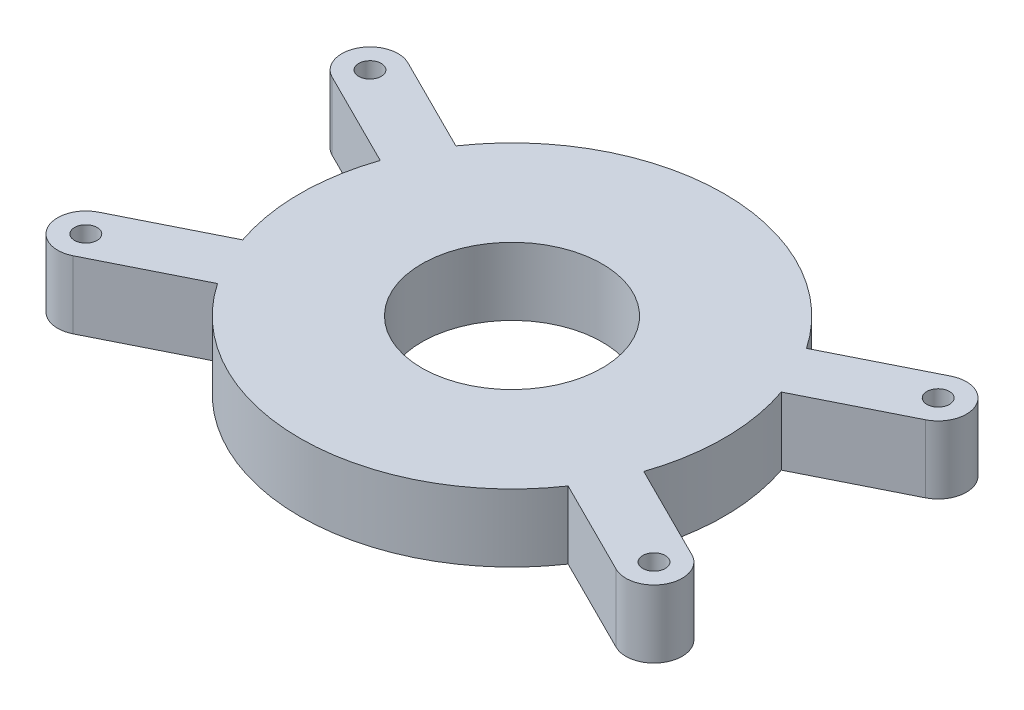
ISO-10303-21;
HEADER;
FILE_DESCRIPTION(('STEP AP214'),'2;1');
FILE_NAME('part.step','',(''),(''),'','','');
FILE_SCHEMA(('AUTOMOTIVE_DESIGN { 1 0 10303 214 1 1 1 1 }'));
ENDSEC;
DATA;
#1=APPLICATION_CONTEXT('core data for automotive mechanical design processes');
#2=APPLICATION_PROTOCOL_DEFINITION('international standard','automotive_design',2000,#1);
#3=PRODUCT_CONTEXT('',#1,'mechanical');
#4=PRODUCT('Part','Part','',(#3));
#5=PRODUCT_RELATED_PRODUCT_CATEGORY('part','',(#4));
#6=PRODUCT_DEFINITION_FORMATION('','',#4);
#7=PRODUCT_DEFINITION_CONTEXT('part definition',#1,'design');
#8=PRODUCT_DEFINITION('design','',#6,#7);
#9=PRODUCT_DEFINITION_SHAPE('','',#8);
#10=(LENGTH_UNIT() NAMED_UNIT(*) SI_UNIT(.MILLI.,.METRE.));
#11=(NAMED_UNIT(*) PLANE_ANGLE_UNIT() SI_UNIT($,.RADIAN.));
#12=(NAMED_UNIT(*) SI_UNIT($,.STERADIAN.) SOLID_ANGLE_UNIT());
#13=UNCERTAINTY_MEASURE_WITH_UNIT(LENGTH_MEASURE(1.E-05),#10,'distance_accuracy_value','');
#14=(GEOMETRIC_REPRESENTATION_CONTEXT(3) GLOBAL_UNCERTAINTY_ASSIGNED_CONTEXT((#13)) GLOBAL_UNIT_ASSIGNED_CONTEXT((#10,
#11,#12)) REPRESENTATION_CONTEXT('',''));
#15=CARTESIAN_POINT('',(0.,0.,0.));
#16=DIRECTION('',(0.,0.,1.));
#17=DIRECTION('',(1.,0.,0.));
#18=AXIS2_PLACEMENT_3D('',#15,#16,#17);
#19=CARTESIAN_POINT('',(0.,15.,0.));
#20=DIRECTION('',(0.,-1.,0.));
#21=DIRECTION('',(0.,0.,-1.));
#22=AXIS2_PLACEMENT_3D('',#19,#20,#21);
#23=CYLINDRICAL_SURFACE('',#22,47.);
#24=CARTESIAN_POINT('',(0.,0.,0.));
#25=DIRECTION('',(0.,1.,0.));
#26=DIRECTION('',(0.,0.,1.));
#27=AXIS2_PLACEMENT_3D('',#24,#25,#26);
#28=CIRCLE('',#27,47.);
#29=CARTESIAN_POINT('',(-38.8673659711493,0.,26.425893787434));
#30=VERTEX_POINT('',#29);
#31=CARTESIAN_POINT('',(38.8673659711494,0.,26.425893787434));
#32=VERTEX_POINT('',#31);
#33=EDGE_CURVE('E245',#30,#32,#28,.T.);
#34=ORIENTED_EDGE('',*,*,#33,.T.);
#35=DIRECTION('',(0.,-1.,0.));
#36=VECTOR('',#35,1.);
#37=CARTESIAN_POINT('',(38.8673659711494,15.,26.425893787434));
#38=LINE('',#37,#36);
#39=CARTESIAN_POINT('',(38.8673659711494,15.,26.425893787434));
#40=VERTEX_POINT('',#39);
#41=EDGE_CURVE('E12',#40,#32,#38,.T.);
#42=ORIENTED_EDGE('',*,*,#41,.F.);
#43=CARTESIAN_POINT('',(0.,15.,0.));
#44=DIRECTION('',(0.,1.,0.));
#45=DIRECTION('',(0.,0.,1.));
#46=AXIS2_PLACEMENT_3D('',#43,#44,#45);
#47=CIRCLE('',#46,47.);
#48=CARTESIAN_POINT('',(-38.8673659711493,15.,26.425893787434));
#49=VERTEX_POINT('',#48);
#50=EDGE_CURVE('E175',#49,#40,#47,.T.);
#51=ORIENTED_EDGE('',*,*,#50,.F.);
#52=DIRECTION('',(0.,-1.,0.));
#53=VECTOR('',#52,1.);
#54=CARTESIAN_POINT('',(-38.8673659711493,15.,26.425893787434));
#55=LINE('',#54,#53);
#56=EDGE_CURVE('E241',#49,#30,#55,.T.);
#57=ORIENTED_EDGE('',*,*,#56,.T.);
#58=EDGE_LOOP('',(#34,#42,#51,#57));
#59=FACE_BOUND('',#58,.T.);
#60=ADVANCED_FACE('F93',(#59),#23,.T.);
#61=CARTESIAN_POINT('',(-2.79556780261696,15.,5.58992850231311));
#62=DIRECTION('',(-0.447290848418707,0.,0.894388560370085));
#63=DIRECTION('',(0.894388560370085,0.,0.447290848418707));
#64=AXIS2_PLACEMENT_3D('',#61,#62,#63);
#65=PLANE('',#64);
#66=DIRECTION('',(-0.894388560370085,0.,-0.447290848418707));
#67=VECTOR('',#66,1.);
#68=CARTESIAN_POINT('',(-2.79556780261696,0.,5.58992850231311));
#69=LINE('',#68,#67);
#70=CARTESIAN_POINT('',(60.1908307594318,0.,37.089928502313));
#71=VERTEX_POINT('',#70);
#72=EDGE_CURVE('E249',#71,#32,#69,.T.);
#73=ORIENTED_EDGE('',*,*,#72,.F.);
#74=DIRECTION('',(0.,-1.,0.));
#75=VECTOR('',#74,1.);
#76=CARTESIAN_POINT('',(60.1908307594318,15.,37.089928502313));
#77=LINE('',#76,#75);
#78=CARTESIAN_POINT('',(60.1908307594318,15.,37.089928502313));
#79=VERTEX_POINT('',#78);
#80=EDGE_CURVE('E103',#79,#71,#77,.T.);
#81=ORIENTED_EDGE('',*,*,#80,.F.);
#82=DIRECTION('',(-0.894388560370085,0.,-0.447290848418707));
#83=VECTOR('',#82,1.);
#84=CARTESIAN_POINT('',(-2.79556780261696,15.,5.58992850231311));
#85=LINE('',#84,#83);
#86=EDGE_CURVE('E327',#79,#40,#85,.T.);
#87=ORIENTED_EDGE('',*,*,#86,.T.);
#88=ORIENTED_EDGE('',*,*,#41,.T.);
#89=EDGE_LOOP('',(#73,#81,#87,#88));
#90=FACE_BOUND('',#89,.T.);
#91=ADVANCED_FACE('F408',(#90),#65,.T.);
#92=CARTESIAN_POINT('',(62.9863985620487,15.,31.5));
#93=DIRECTION('',(0.,-1.,0.));
#94=DIRECTION('',(0.,0.,-1.));
#95=AXIS2_PLACEMENT_3D('',#92,#93,#94);
#96=CYLINDRICAL_SURFACE('',#95,6.25);
#97=CARTESIAN_POINT('',(62.9863985620487,0.,31.5));
#98=DIRECTION('',(0.,1.,0.));
#99=DIRECTION('',(0.,0.,1.));
#100=AXIS2_PLACEMENT_3D('',#97,#98,#99);
#101=CIRCLE('',#100,6.25);
#102=CARTESIAN_POINT('',(65.7819663646656,0.,25.9100714976869));
#103=VERTEX_POINT('',#102);
#104=EDGE_CURVE('E254',#103,#71,#101,.F.);
#105=ORIENTED_EDGE('',*,*,#104,.F.);
#106=DIRECTION('',(0.,-1.,0.));
#107=VECTOR('',#106,1.);
#108=CARTESIAN_POINT('',(65.7819663646656,15.,25.9100714976869));
#109=LINE('',#108,#107);
#110=CARTESIAN_POINT('',(65.7819663646656,15.,25.9100714976869));
#111=VERTEX_POINT('',#110);
#112=EDGE_CURVE('E301',#111,#103,#109,.T.);
#113=ORIENTED_EDGE('',*,*,#112,.F.);
#114=CARTESIAN_POINT('',(62.9863985620487,15.,31.5));
#115=DIRECTION('',(0.,1.,0.));
#116=DIRECTION('',(0.,0.,1.));
#117=AXIS2_PLACEMENT_3D('',#114,#115,#116);
#118=CIRCLE('',#117,6.25);
#119=EDGE_CURVE('E331',#111,#79,#118,.F.);
#120=ORIENTED_EDGE('',*,*,#119,.T.);
#121=ORIENTED_EDGE('',*,*,#80,.T.);
#122=EDGE_LOOP('',(#105,#113,#120,#121));
#123=FACE_BOUND('',#122,.T.);
#124=ADVANCED_FACE('F413',(#123),#96,.T.);
#125=CARTESIAN_POINT('',(2.7955678026169,15.,-5.58992850231299));
#126=DIRECTION('',(-0.447290848418707,0.,0.894388560370085));
#127=DIRECTION('',(0.894388560370085,0.,0.447290848418707));
#128=AXIS2_PLACEMENT_3D('',#125,#126,#127);
#129=PLANE('',#128);
#130=DIRECTION('',(-0.894388560370085,0.,-0.447290848418707));
#131=VECTOR('',#130,1.);
#132=CARTESIAN_POINT('',(2.7955678026169,0.,-5.58992850231299));
#133=LINE('',#132,#131);
#134=CARTESIAN_POINT('',(44.4585015763832,0.,15.2460367828079));
#135=VERTEX_POINT('',#134);
#136=EDGE_CURVE('E257',#103,#135,#133,.T.);
#137=ORIENTED_EDGE('',*,*,#136,.T.);
#138=DIRECTION('',(0.,-1.,0.));
#139=VECTOR('',#138,1.);
#140=CARTESIAN_POINT('',(44.4585015763832,15.,15.2460367828079));
#141=LINE('',#140,#139);
#142=CARTESIAN_POINT('',(44.4585015763832,15.,15.2460367828079));
#143=VERTEX_POINT('',#142);
#144=EDGE_CURVE('E298',#143,#135,#141,.T.);
#145=ORIENTED_EDGE('',*,*,#144,.F.);
#146=DIRECTION('',(-0.894388560370085,0.,-0.447290848418707));
#147=VECTOR('',#146,1.);
#148=CARTESIAN_POINT('',(2.7955678026169,15.,-5.58992850231299));
#149=LINE('',#148,#147);
#150=EDGE_CURVE('E334',#111,#143,#149,.T.);
#151=ORIENTED_EDGE('',*,*,#150,.F.);
#152=ORIENTED_EDGE('',*,*,#112,.T.);
#153=EDGE_LOOP('',(#137,#145,#151,#152));
#154=FACE_BOUND('',#153,.T.);
#155=ADVANCED_FACE('F419',(#154),#129,.F.);
#156=CARTESIAN_POINT('',(44.4585015763832,0.,-15.2460367828079));
#157=VERTEX_POINT('',#156);
#158=EDGE_CURVE('E251',#135,#157,#28,.T.);
#159=ORIENTED_EDGE('',*,*,#158,.T.);
#160=DIRECTION('',(0.,-1.,0.));
#161=VECTOR('',#160,1.);
#162=CARTESIAN_POINT('',(44.4585015763832,15.,-15.2460367828079));
#163=LINE('',#162,#161);
#164=CARTESIAN_POINT('',(44.4585015763832,15.,-15.2460367828079));
#165=VERTEX_POINT('',#164);
#166=EDGE_CURVE('E296',#165,#157,#163,.T.);
#167=ORIENTED_EDGE('',*,*,#166,.F.);
#168=EDGE_CURVE('E328',#143,#165,#47,.T.);
#169=ORIENTED_EDGE('',*,*,#168,.F.);
#170=ORIENTED_EDGE('',*,*,#144,.T.);
#171=EDGE_LOOP('',(#159,#167,#169,#170));
#172=FACE_BOUND('',#171,.T.);
#173=ADVANCED_FACE('F355',(#172),#23,.T.);
#174=CARTESIAN_POINT('',(2.79556780261694,15.,5.58992850231305));
#175=DIRECTION('',(0.447290848418708,0.,0.894388560370084));
#176=DIRECTION('',(0.894388560370084,0.,-0.447290848418708));
#177=AXIS2_PLACEMENT_3D('',#174,#175,#176);
#178=PLANE('',#177);
#179=DIRECTION('',(-0.894388560370084,0.,0.447290848418708));
#180=VECTOR('',#179,1.);
#181=CARTESIAN_POINT('',(2.79556780261694,0.,5.58992850231305));
#182=LINE('',#181,#180);
#183=CARTESIAN_POINT('',(65.7819663646656,0.,-25.910071497687));
#184=VERTEX_POINT('',#183);
#185=EDGE_CURVE('E259',#184,#157,#182,.T.);
#186=ORIENTED_EDGE('',*,*,#185,.F.);
#187=DIRECTION('',(0.,-1.,0.));
#188=VECTOR('',#187,1.);
#189=CARTESIAN_POINT('',(65.7819663646656,15.,-25.910071497687));
#190=LINE('',#189,#188);
#191=CARTESIAN_POINT('',(65.7819663646656,15.,-25.910071497687));
#192=VERTEX_POINT('',#191);
#193=EDGE_CURVE('E294',#192,#184,#190,.T.);
#194=ORIENTED_EDGE('',*,*,#193,.F.);
#195=DIRECTION('',(-0.894388560370084,0.,0.447290848418708));
#196=VECTOR('',#195,1.);
#197=CARTESIAN_POINT('',(2.79556780261694,15.,5.58992850231305));
#198=LINE('',#197,#196);
#199=EDGE_CURVE('E336',#192,#165,#198,.T.);
#200=ORIENTED_EDGE('',*,*,#199,.T.);
#201=ORIENTED_EDGE('',*,*,#166,.T.);
#202=EDGE_LOOP('',(#186,#194,#200,#201));
#203=FACE_BOUND('',#202,.T.);
#204=ADVANCED_FACE('F359',(#203),#178,.T.);
#205=CARTESIAN_POINT('',(62.9863985620487,15.,-31.5));
#206=DIRECTION('',(0.,-1.,0.));
#207=DIRECTION('',(0.,0.,-1.));
#208=AXIS2_PLACEMENT_3D('',#205,#206,#207);
#209=CYLINDRICAL_SURFACE('',#208,6.25);
#210=CARTESIAN_POINT('',(62.9863985620487,0.,-31.5));
#211=DIRECTION('',(0.,1.,0.));
#212=DIRECTION('',(0.,0.,1.));
#213=AXIS2_PLACEMENT_3D('',#210,#211,#212);
#214=CIRCLE('',#213,6.25);
#215=CARTESIAN_POINT('',(60.1908307594318,0.,-37.089928502313));
#216=VERTEX_POINT('',#215);
#217=EDGE_CURVE('E262',#184,#216,#214,.T.);
#218=ORIENTED_EDGE('',*,*,#217,.T.);
#219=DIRECTION('',(0.,-1.,0.));
#220=VECTOR('',#219,1.);
#221=CARTESIAN_POINT('',(60.1908307594318,15.,-37.089928502313));
#222=LINE('',#221,#220);
#223=CARTESIAN_POINT('',(60.1908307594318,15.,-37.089928502313));
#224=VERTEX_POINT('',#223);
#225=EDGE_CURVE('E291',#224,#216,#222,.T.);
#226=ORIENTED_EDGE('',*,*,#225,.F.);
#227=CARTESIAN_POINT('',(62.9863985620487,15.,-31.5));
#228=DIRECTION('',(0.,1.,0.));
#229=DIRECTION('',(0.,0.,1.));
#230=AXIS2_PLACEMENT_3D('',#227,#228,#229);
#231=CIRCLE('',#230,6.25);
#232=EDGE_CURVE('E339',#192,#224,#231,.T.);
#233=ORIENTED_EDGE('',*,*,#232,.F.);
#234=ORIENTED_EDGE('',*,*,#193,.T.);
#235=EDGE_LOOP('',(#218,#226,#233,#234));
#236=FACE_BOUND('',#235,.T.);
#237=ADVANCED_FACE('F364',(#236),#209,.T.);
#238=CARTESIAN_POINT('',(-2.79556780261693,15.,-5.58992850231305));
#239=DIRECTION('',(0.447290848418708,0.,0.894388560370085));
#240=DIRECTION('',(0.894388560370085,0.,-0.447290848418708));
#241=AXIS2_PLACEMENT_3D('',#238,#239,#240);
#242=PLANE('',#241);
#243=DIRECTION('',(-0.894388560370085,0.,0.447290848418708));
#244=VECTOR('',#243,1.);
#245=CARTESIAN_POINT('',(-2.79556780261693,0.,-5.58992850231305));
#246=LINE('',#245,#244);
#247=CARTESIAN_POINT('',(38.8673659711494,0.,-26.425893787434));
#248=VERTEX_POINT('',#247);
#249=EDGE_CURVE('E264',#216,#248,#246,.T.);
#250=ORIENTED_EDGE('',*,*,#249,.T.);
#251=DIRECTION('',(0.,-1.,0.));
#252=VECTOR('',#251,1.);
#253=CARTESIAN_POINT('',(38.8673659711494,15.,-26.425893787434));
#254=LINE('',#253,#252);
#255=CARTESIAN_POINT('',(38.8673659711494,15.,-26.425893787434));
#256=VERTEX_POINT('',#255);
#257=EDGE_CURVE('E288',#256,#248,#254,.T.);
#258=ORIENTED_EDGE('',*,*,#257,.F.);
#259=DIRECTION('',(-0.894388560370085,0.,0.447290848418708));
#260=VECTOR('',#259,1.);
#261=CARTESIAN_POINT('',(-2.79556780261693,15.,-5.58992850231305));
#262=LINE('',#261,#260);
#263=EDGE_CURVE('E341',#224,#256,#262,.T.);
#264=ORIENTED_EDGE('',*,*,#263,.F.);
#265=ORIENTED_EDGE('',*,*,#225,.T.);
#266=EDGE_LOOP('',(#250,#258,#264,#265));
#267=FACE_BOUND('',#266,.T.);
#268=ADVANCED_FACE('F368',(#267),#242,.F.);
#269=CARTESIAN_POINT('',(-38.8673659711493,0.,-26.425893787434));
#270=VERTEX_POINT('',#269);
#271=EDGE_CURVE('E266',#248,#270,#28,.T.);
#272=ORIENTED_EDGE('',*,*,#271,.T.);
#273=DIRECTION('',(0.,-1.,0.));
#274=VECTOR('',#273,1.);
#275=CARTESIAN_POINT('',(-38.8673659711493,15.,-26.425893787434));
#276=LINE('',#275,#274);
#277=CARTESIAN_POINT('',(-38.8673659711493,15.,-26.425893787434));
#278=VERTEX_POINT('',#277);
#279=EDGE_CURVE('E286',#278,#270,#276,.T.);
#280=ORIENTED_EDGE('',*,*,#279,.F.);
#281=EDGE_CURVE('E236',#256,#278,#47,.T.);
#282=ORIENTED_EDGE('',*,*,#281,.F.);
#283=ORIENTED_EDGE('',*,*,#257,.T.);
#284=EDGE_LOOP('',(#272,#280,#282,#283));
#285=FACE_BOUND('',#284,.T.);
#286=ADVANCED_FACE('F373',(#285),#23,.T.);
#287=CARTESIAN_POINT('',(2.79556780261699,15.,-5.58992850231319));
#288=DIRECTION('',(0.447290848418706,0.,-0.894388560370086));
#289=DIRECTION('',(-0.894388560370086,0.,-0.447290848418706));
#290=AXIS2_PLACEMENT_3D('',#287,#288,#289);
#291=PLANE('',#290);
#292=DIRECTION('',(0.894388560370086,0.,0.447290848418706));
#293=VECTOR('',#292,1.);
#294=CARTESIAN_POINT('',(2.79556780261699,0.,-5.58992850231319));
#295=LINE('',#294,#293);
#296=CARTESIAN_POINT('',(-60.1908307594317,0.,-37.089928502313));
#297=VERTEX_POINT('',#296);
#298=EDGE_CURVE('E267',#297,#270,#295,.T.);
#299=ORIENTED_EDGE('',*,*,#298,.F.);
#300=DIRECTION('',(0.,-1.,0.));
#301=VECTOR('',#300,1.);
#302=CARTESIAN_POINT('',(-60.1908307594317,15.,-37.089928502313));
#303=LINE('',#302,#301);
#304=CARTESIAN_POINT('',(-60.1908307594317,15.,-37.089928502313));
#305=VERTEX_POINT('',#304);
#306=EDGE_CURVE('E284',#305,#297,#303,.T.);
#307=ORIENTED_EDGE('',*,*,#306,.F.);
#308=DIRECTION('',(0.894388560370086,0.,0.447290848418706));
#309=VECTOR('',#308,1.);
#310=CARTESIAN_POINT('',(2.79556780261699,15.,-5.58992850231319));
#311=LINE('',#310,#309);
#312=EDGE_CURVE('E342',#305,#278,#311,.T.);
#313=ORIENTED_EDGE('',*,*,#312,.T.);
#314=ORIENTED_EDGE('',*,*,#279,.T.);
#315=EDGE_LOOP('',(#299,#307,#313,#314));
#316=FACE_BOUND('',#315,.T.);
#317=ADVANCED_FACE('F374',(#316),#291,.T.);
#318=CARTESIAN_POINT('',(-2.79556780261686,15.,5.58992850231292));
#319=DIRECTION('',(0.447290848418706,0.,-0.894388560370085));
#320=DIRECTION('',(-0.894388560370085,0.,-0.447290848418706));
#321=AXIS2_PLACEMENT_3D('',#318,#319,#320);
#322=PLANE('',#321);
#323=DIRECTION('',(0.894388560370086,0.,0.447290848418707));
#324=VECTOR('',#323,1.);
#325=CARTESIAN_POINT('',(-2.79556780261686,0.,5.58992850231292));
#326=LINE('',#325,#324);
#327=CARTESIAN_POINT('',(-65.7819663646656,0.,-25.910071497687));
#328=VERTEX_POINT('',#327);
#329=CARTESIAN_POINT('',(-44.4585015763832,0.,-15.2460367828079));
#330=VERTEX_POINT('',#329);
#331=EDGE_CURVE('E270',#328,#330,#326,.T.);
#332=ORIENTED_EDGE('',*,*,#331,.T.);
#333=DIRECTION('',(0.,-1.,0.));
#334=VECTOR('',#333,1.);
#335=CARTESIAN_POINT('',(-44.4585015763832,15.,-15.2460367828079));
#336=LINE('',#335,#334);
#337=CARTESIAN_POINT('',(-44.4585015763832,15.,-15.2460367828079));
#338=VERTEX_POINT('',#337);
#339=EDGE_CURVE('E279',#338,#330,#336,.T.);
#340=ORIENTED_EDGE('',*,*,#339,.F.);
#341=DIRECTION('',(0.894388560370086,0.,0.447290848418707));
#342=VECTOR('',#341,1.);
#343=CARTESIAN_POINT('',(-2.79556780261686,15.,5.58992850231292));
#344=LINE('',#343,#342);
#345=CARTESIAN_POINT('',(-65.7819663646656,15.,-25.910071497687));
#346=VERTEX_POINT('',#345);
#347=EDGE_CURVE('E234',#346,#338,#344,.T.);
#348=ORIENTED_EDGE('',*,*,#347,.F.);
#349=DIRECTION('',(0.,-1.,0.));
#350=VECTOR('',#349,1.);
#351=CARTESIAN_POINT('',(-65.7819663646656,15.,-25.910071497687));
#352=LINE('',#351,#350);
#353=EDGE_CURVE('E282',#346,#328,#352,.T.);
#354=ORIENTED_EDGE('',*,*,#353,.T.);
#355=EDGE_LOOP('',(#332,#340,#348,#354));
#356=FACE_BOUND('',#355,.T.);
#357=ADVANCED_FACE('F421',(#356),#322,.F.);
#358=CARTESIAN_POINT('',(-44.4585015763832,0.,15.2460367828079));
#359=VERTEX_POINT('',#358);
#360=EDGE_CURVE('E250',#330,#359,#28,.T.);
#361=ORIENTED_EDGE('',*,*,#360,.T.);
#362=DIRECTION('',(0.,-1.,0.));
#363=VECTOR('',#362,1.);
#364=CARTESIAN_POINT('',(-44.4585015763832,15.,15.2460367828079));
#365=LINE('',#364,#363);
#366=CARTESIAN_POINT('',(-44.4585015763832,15.,15.2460367828079));
#367=VERTEX_POINT('',#366);
#368=EDGE_CURVE('E223',#367,#359,#365,.T.);
#369=ORIENTED_EDGE('',*,*,#368,.F.);
#370=EDGE_CURVE('E231',#338,#367,#47,.T.);
#371=ORIENTED_EDGE('',*,*,#370,.F.);
#372=ORIENTED_EDGE('',*,*,#339,.T.);
#373=EDGE_LOOP('',(#361,#369,#371,#372));
#374=FACE_BOUND('',#373,.T.);
#375=ADVANCED_FACE('F380',(#374),#23,.T.);
#376=CARTESIAN_POINT('',(-2.79556780261686,15.,-5.58992850231292));
#377=DIRECTION('',(-0.447290848418706,0.,-0.894388560370085));
#378=DIRECTION('',(-0.894388560370085,0.,0.447290848418706));
#379=AXIS2_PLACEMENT_3D('',#376,#377,#378);
#380=PLANE('',#379);
#381=DIRECTION('',(0.894388560370086,0.,-0.447290848418707));
#382=VECTOR('',#381,1.);
#383=CARTESIAN_POINT('',(-2.79556780261686,0.,-5.58992850231292));
#384=LINE('',#383,#382);
#385=CARTESIAN_POINT('',(-65.7819663646656,0.,25.9100714976869));
#386=VERTEX_POINT('',#385);
#387=EDGE_CURVE('E222',#386,#359,#384,.T.);
#388=ORIENTED_EDGE('',*,*,#387,.F.);
#389=DIRECTION('',(0.,-1.,0.));
#390=VECTOR('',#389,1.);
#391=CARTESIAN_POINT('',(-65.7819663646656,15.,25.9100714976869));
#392=LINE('',#391,#390);
#393=CARTESIAN_POINT('',(-65.7819663646656,15.,25.9100714976869));
#394=VERTEX_POINT('',#393);
#395=EDGE_CURVE('E216',#394,#386,#392,.T.);
#396=ORIENTED_EDGE('',*,*,#395,.F.);
#397=DIRECTION('',(0.894388560370086,0.,-0.447290848418707));
#398=VECTOR('',#397,1.);
#399=CARTESIAN_POINT('',(-2.79556780261686,15.,-5.58992850231292));
#400=LINE('',#399,#398);
#401=EDGE_CURVE('E220',#394,#367,#400,.T.);
#402=ORIENTED_EDGE('',*,*,#401,.T.);
#403=ORIENTED_EDGE('',*,*,#368,.T.);
#404=EDGE_LOOP('',(#388,#396,#402,#403));
#405=FACE_BOUND('',#404,.T.);
#406=ADVANCED_FACE('F218',(#405),#380,.T.);
#407=CARTESIAN_POINT('',(-62.9863985620487,15.,31.5));
#408=DIRECTION('',(0.,-1.,0.));
#409=DIRECTION('',(0.,0.,-1.));
#410=AXIS2_PLACEMENT_3D('',#407,#408,#409);
#411=CYLINDRICAL_SURFACE('',#410,6.25000000000001);
#412=CARTESIAN_POINT('',(-62.9863985620487,0.,31.5));
#413=DIRECTION('',(0.,1.,0.));
#414=DIRECTION('',(0.,0.,1.));
#415=AXIS2_PLACEMENT_3D('',#412,#413,#414);
#416=CIRCLE('',#415,6.25000000000001);
#417=CARTESIAN_POINT('',(-60.1908307594317,0.,37.089928502313));
#418=VERTEX_POINT('',#417);
#419=EDGE_CURVE('E163',#386,#418,#416,.T.);
#420=ORIENTED_EDGE('',*,*,#419,.T.);
#421=DIRECTION('',(0.,-1.,0.));
#422=VECTOR('',#421,1.);
#423=CARTESIAN_POINT('',(-60.1908307594317,15.,37.089928502313));
#424=LINE('',#423,#422);
#425=CARTESIAN_POINT('',(-60.1908307594317,15.,37.089928502313));
#426=VERTEX_POINT('',#425);
#427=EDGE_CURVE('E224',#426,#418,#424,.T.);
#428=ORIENTED_EDGE('',*,*,#427,.F.);
#429=CARTESIAN_POINT('',(-62.9863985620487,15.,31.5));
#430=DIRECTION('',(0.,1.,0.));
#431=DIRECTION('',(0.,0.,1.));
#432=AXIS2_PLACEMENT_3D('',#429,#430,#431);
#433=CIRCLE('',#432,6.25000000000001);
#434=EDGE_CURVE('E226',#394,#426,#433,.T.);
#435=ORIENTED_EDGE('',*,*,#434,.F.);
#436=ORIENTED_EDGE('',*,*,#395,.T.);
#437=EDGE_LOOP('',(#420,#428,#435,#436));
#438=FACE_BOUND('',#437,.T.);
#439=ADVANCED_FACE('F227',(#438),#411,.T.);
#440=CARTESIAN_POINT('',(0.,15.,0.));
#441=DIRECTION('',(0.,-1.,0.));
#442=DIRECTION('',(0.,0.,-1.));
#443=AXIS2_PLACEMENT_3D('',#440,#441,#442);
#444=CYLINDRICAL_SURFACE('',#443,20.);
#445=CARTESIAN_POINT('',(0.,15.,0.));
#446=DIRECTION('',(0.,1.,0.));
#447=DIRECTION('',(0.,0.,1.));
#448=AXIS2_PLACEMENT_3D('',#445,#446,#447);
#449=CIRCLE('',#448,20.);
#450=CARTESIAN_POINT('',(0.,15.,20.));
#451=VERTEX_POINT('',#450);
#452=EDGE_CURVE('E275',#451,#451,#449,.T.);
#453=ORIENTED_EDGE('',*,*,#452,.T.);
#454=EDGE_LOOP('',(#453));
#455=FACE_BOUND('',#454,.T.);
#456=CARTESIAN_POINT('',(0.,0.,0.));
#457=DIRECTION('',(0.,1.,0.));
#458=DIRECTION('',(0.,0.,1.));
#459=AXIS2_PLACEMENT_3D('',#456,#457,#458);
#460=CIRCLE('',#459,20.);
#461=CARTESIAN_POINT('',(0.,0.,20.));
#462=VERTEX_POINT('',#461);
#463=EDGE_CURVE('E242',#462,#462,#460,.T.);
#464=ORIENTED_EDGE('',*,*,#463,.F.);
#465=EDGE_LOOP('',(#464));
#466=FACE_BOUND('',#465,.T.);
#467=ADVANCED_FACE('F386',(#455,#466),#444,.F.);
#468=CARTESIAN_POINT('',(2.79556780261699,15.,5.58992850231319));
#469=DIRECTION('',(-0.447290848418706,0.,-0.894388560370086));
#470=DIRECTION('',(-0.894388560370086,0.,0.447290848418706));
#471=AXIS2_PLACEMENT_3D('',#468,#469,#470);
#472=PLANE('',#471);
#473=DIRECTION('',(0.894388560370086,0.,-0.447290848418706));
#474=VECTOR('',#473,1.);
#475=CARTESIAN_POINT('',(2.79556780261699,0.,5.58992850231319));
#476=LINE('',#475,#474);
#477=EDGE_CURVE('E169',#418,#30,#476,.T.);
#478=ORIENTED_EDGE('',*,*,#477,.T.);
#479=ORIENTED_EDGE('',*,*,#56,.F.);
#480=DIRECTION('',(0.894388560370086,0.,-0.447290848418706));
#481=VECTOR('',#480,1.);
#482=CARTESIAN_POINT('',(2.79556780261699,15.,5.58992850231319));
#483=LINE('',#482,#481);
#484=EDGE_CURVE('E112',#426,#49,#483,.T.);
#485=ORIENTED_EDGE('',*,*,#484,.F.);
#486=ORIENTED_EDGE('',*,*,#427,.T.);
#487=EDGE_LOOP('',(#478,#479,#485,#486));
#488=FACE_BOUND('',#487,.T.);
#489=ADVANCED_FACE('F384',(#488),#472,.F.);
#490=CARTESIAN_POINT('',(0.,15.,0.));
#491=DIRECTION('',(0.,1.,0.));
#492=DIRECTION('',(0.,0.,1.));
#493=AXIS2_PLACEMENT_3D('',#490,#491,#492);
#494=PLANE('',#493);
#495=CARTESIAN_POINT('',(62.9863985620487,15.,-31.5));
#496=DIRECTION('',(0.,-1.,0.));
#497=DIRECTION('',(0.,0.,1.));
#498=AXIS2_PLACEMENT_3D('',#495,#496,#497);
#499=CIRCLE('',#498,2.50000000000001);
#500=CARTESIAN_POINT('',(62.9863985620487,15.,-29.));
#501=VERTEX_POINT('',#500);
#502=EDGE_CURVE('E827',#501,#501,#499,.T.);
#503=ORIENTED_EDGE('',*,*,#502,.T.);
#504=EDGE_LOOP('',(#503));
#505=FACE_BOUND('',#504,.T.);
#506=CARTESIAN_POINT('',(62.9863985620487,15.,31.5));
#507=DIRECTION('',(0.,1.,0.));
#508=DIRECTION('',(0.,0.,-1.));
#509=AXIS2_PLACEMENT_3D('',#506,#507,#508);
#510=CIRCLE('',#509,2.50000000000001);
#511=CARTESIAN_POINT('',(62.9863985620487,15.,29.));
#512=VERTEX_POINT('',#511);
#513=EDGE_CURVE('E833',#512,#512,#510,.T.);
#514=ORIENTED_EDGE('',*,*,#513,.F.);
#515=EDGE_LOOP('',(#514));
#516=FACE_BOUND('',#515,.T.);
#517=CARTESIAN_POINT('',(-62.9863985620487,15.,31.5));
#518=DIRECTION('',(0.,-1.,0.));
#519=DIRECTION('',(0.,0.,-1.));
#520=AXIS2_PLACEMENT_3D('',#517,#518,#519);
#521=CIRCLE('',#520,2.50000000000001);
#522=CARTESIAN_POINT('',(-62.9863985620487,15.,29.));
#523=VERTEX_POINT('',#522);
#524=EDGE_CURVE('E322',#523,#523,#521,.T.);
#525=ORIENTED_EDGE('',*,*,#524,.T.);
#526=EDGE_LOOP('',(#525));
#527=FACE_BOUND('',#526,.T.);
#528=CARTESIAN_POINT('',(-62.9863985620487,15.,-31.5));
#529=DIRECTION('',(0.,1.,0.));
#530=DIRECTION('',(0.,0.,1.));
#531=AXIS2_PLACEMENT_3D('',#528,#529,#530);
#532=CIRCLE('',#531,2.50000000000001);
#533=CARTESIAN_POINT('',(-62.9863985620487,15.,-29.));
#534=VERTEX_POINT('',#533);
#535=EDGE_CURVE('E314',#534,#534,#532,.T.);
#536=ORIENTED_EDGE('',*,*,#535,.F.);
#537=EDGE_LOOP('',(#536));
#538=FACE_BOUND('',#537,.T.);
#539=ORIENTED_EDGE('',*,*,#452,.F.);
#540=EDGE_LOOP('',(#539));
#541=FACE_BOUND('',#540,.T.);
#542=ORIENTED_EDGE('',*,*,#50,.T.);
#543=ORIENTED_EDGE('',*,*,#86,.F.);
#544=ORIENTED_EDGE('',*,*,#119,.F.);
#545=ORIENTED_EDGE('',*,*,#150,.T.);
#546=ORIENTED_EDGE('',*,*,#168,.T.);
#547=ORIENTED_EDGE('',*,*,#199,.F.);
#548=ORIENTED_EDGE('',*,*,#232,.T.);
#549=ORIENTED_EDGE('',*,*,#263,.T.);
#550=ORIENTED_EDGE('',*,*,#281,.T.);
#551=ORIENTED_EDGE('',*,*,#312,.F.);
#552=CARTESIAN_POINT('',(-62.9863985620487,15.,-31.5));
#553=DIRECTION('',(0.,-1.,0.));
#554=DIRECTION('',(0.,0.,-1.));
#555=AXIS2_PLACEMENT_3D('',#552,#553,#554);
#556=CIRCLE('',#555,6.25000000000001);
#557=EDGE_CURVE('E246',#346,#305,#556,.T.);
#558=ORIENTED_EDGE('',*,*,#557,.F.);
#559=ORIENTED_EDGE('',*,*,#347,.T.);
#560=ORIENTED_EDGE('',*,*,#370,.T.);
#561=ORIENTED_EDGE('',*,*,#401,.F.);
#562=ORIENTED_EDGE('',*,*,#434,.T.);
#563=ORIENTED_EDGE('',*,*,#484,.T.);
#564=EDGE_LOOP('',(#542,#543,#544,#545,#546,#547,#548,#549,#550,#551,#558,#559,#560,#561,#562,#563));
#565=FACE_BOUND('',#564,.T.);
#566=ADVANCED_FACE('F229',(#505,#516,#527,#538,#541,#565),#494,.T.);
#567=CARTESIAN_POINT('',(0.,0.,0.));
#568=DIRECTION('',(0.,1.,0.));
#569=DIRECTION('',(0.,0.,1.));
#570=AXIS2_PLACEMENT_3D('',#567,#568,#569);
#571=PLANE('',#570);
#572=CARTESIAN_POINT('',(-62.9863985620487,0.,-31.5));
#573=DIRECTION('',(0.,1.,0.));
#574=DIRECTION('',(0.,0.,1.));
#575=AXIS2_PLACEMENT_3D('',#572,#573,#574);
#576=CIRCLE('',#575,2.50000000000001);
#577=CARTESIAN_POINT('',(-62.9863985620487,0.,-29.));
#578=VERTEX_POINT('',#577);
#579=EDGE_CURVE('E807',#578,#578,#576,.T.);
#580=ORIENTED_EDGE('',*,*,#579,.T.);
#581=EDGE_LOOP('',(#580));
#582=FACE_BOUND('',#581,.T.);
#583=CARTESIAN_POINT('',(-62.9863985620487,0.,31.5));
#584=DIRECTION('',(0.,-1.,0.));
#585=DIRECTION('',(0.,0.,-1.));
#586=AXIS2_PLACEMENT_3D('',#583,#584,#585);
#587=CIRCLE('',#586,2.50000000000001);
#588=CARTESIAN_POINT('',(-62.9863985620487,0.,29.));
#589=VERTEX_POINT('',#588);
#590=EDGE_CURVE('E806',#589,#589,#587,.T.);
#591=ORIENTED_EDGE('',*,*,#590,.F.);
#592=EDGE_LOOP('',(#591));
#593=FACE_BOUND('',#592,.T.);
#594=CARTESIAN_POINT('',(62.9863985620487,0.,-31.5));
#595=DIRECTION('',(0.,-1.,0.));
#596=DIRECTION('',(0.,0.,1.));
#597=AXIS2_PLACEMENT_3D('',#594,#595,#596);
#598=CIRCLE('',#597,2.50000000000001);
#599=CARTESIAN_POINT('',(62.9863985620487,0.,-29.));
#600=VERTEX_POINT('',#599);
#601=EDGE_CURVE('E816',#600,#600,#598,.T.);
#602=ORIENTED_EDGE('',*,*,#601,.F.);
#603=EDGE_LOOP('',(#602));
#604=FACE_BOUND('',#603,.T.);
#605=CARTESIAN_POINT('',(62.9863985620487,0.,31.5));
#606=DIRECTION('',(0.,1.,0.));
#607=DIRECTION('',(0.,0.,-1.));
#608=AXIS2_PLACEMENT_3D('',#605,#606,#607);
#609=CIRCLE('',#608,2.50000000000001);
#610=CARTESIAN_POINT('',(62.9863985620487,0.,29.));
#611=VERTEX_POINT('',#610);
#612=EDGE_CURVE('E821',#611,#611,#609,.T.);
#613=ORIENTED_EDGE('',*,*,#612,.T.);
#614=EDGE_LOOP('',(#613));
#615=FACE_BOUND('',#614,.T.);
#616=ORIENTED_EDGE('',*,*,#463,.T.);
#617=EDGE_LOOP('',(#616));
#618=FACE_BOUND('',#617,.T.);
#619=ORIENTED_EDGE('',*,*,#33,.F.);
#620=ORIENTED_EDGE('',*,*,#477,.F.);
#621=ORIENTED_EDGE('',*,*,#419,.F.);
#622=ORIENTED_EDGE('',*,*,#387,.T.);
#623=ORIENTED_EDGE('',*,*,#360,.F.);
#624=ORIENTED_EDGE('',*,*,#331,.F.);
#625=CARTESIAN_POINT('',(-62.9863985620487,0.,-31.5));
#626=DIRECTION('',(0.,-1.,0.));
#627=DIRECTION('',(0.,0.,-1.));
#628=AXIS2_PLACEMENT_3D('',#625,#626,#627);
#629=CIRCLE('',#628,6.25000000000001);
#630=EDGE_CURVE('E97',#328,#297,#629,.T.);
#631=ORIENTED_EDGE('',*,*,#630,.T.);
#632=ORIENTED_EDGE('',*,*,#298,.T.);
#633=ORIENTED_EDGE('',*,*,#271,.F.);
#634=ORIENTED_EDGE('',*,*,#249,.F.);
#635=ORIENTED_EDGE('',*,*,#217,.F.);
#636=ORIENTED_EDGE('',*,*,#185,.T.);
#637=ORIENTED_EDGE('',*,*,#158,.F.);
#638=ORIENTED_EDGE('',*,*,#136,.F.);
#639=ORIENTED_EDGE('',*,*,#104,.T.);
#640=ORIENTED_EDGE('',*,*,#72,.T.);
#641=EDGE_LOOP('',(#619,#620,#621,#622,#623,#624,#631,#632,#633,#634,#635,#636,#637,#638,#639,#640));
#642=FACE_BOUND('',#641,.T.);
#643=ADVANCED_FACE('F376',(#582,#593,#604,#615,#618,#642),#571,.F.);
#644=CARTESIAN_POINT('',(-62.9863985620487,15.,-31.5));
#645=DIRECTION('',(0.,-1.,0.));
#646=DIRECTION('',(0.,0.,-1.));
#647=AXIS2_PLACEMENT_3D('',#644,#645,#646);
#648=CYLINDRICAL_SURFACE('',#647,6.25000000000001);
#649=ORIENTED_EDGE('',*,*,#557,.T.);
#650=ORIENTED_EDGE('',*,*,#306,.T.);
#651=ORIENTED_EDGE('',*,*,#630,.F.);
#652=ORIENTED_EDGE('',*,*,#353,.F.);
#653=EDGE_LOOP('',(#649,#650,#651,#652));
#654=FACE_BOUND('',#653,.T.);
#655=ADVANCED_FACE('F95',(#654),#648,.T.);
#656=CARTESIAN_POINT('',(-62.9863985620487,10.,-31.5));
#657=DIRECTION('',(0.,1.,0.));
#658=DIRECTION('',(0.,0.,1.));
#659=AXIS2_PLACEMENT_3D('',#656,#657,#658);
#660=CYLINDRICAL_SURFACE('',#659,2.50000000000001);
#661=CARTESIAN_POINT('',(-62.9863985620487,10.,-31.5));
#662=DIRECTION('',(0.,1.,0.));
#663=DIRECTION('',(0.,0.,1.));
#664=AXIS2_PLACEMENT_3D('',#661,#662,#663);
#665=CIRCLE('',#664,2.50000000000001);
#666=CARTESIAN_POINT('',(-62.9863985620487,10.,-29.));
#667=VERTEX_POINT('',#666);
#668=EDGE_CURVE('E308',#667,#667,#665,.T.);
#669=ORIENTED_EDGE('',*,*,#668,.F.);
#670=EDGE_LOOP('',(#669));
#671=FACE_BOUND('',#670,.T.);
#672=ORIENTED_EDGE('',*,*,#535,.T.);
#673=EDGE_LOOP('',(#672));
#674=FACE_BOUND('',#673,.T.);
#675=ADVANCED_FACE('F398',(#671,#674),#660,.F.);
#676=CARTESIAN_POINT('',(-62.9863985620487,10.,-31.5));
#677=DIRECTION('',(0.,1.,0.));
#678=DIRECTION('',(0.,0.,1.));
#679=AXIS2_PLACEMENT_3D('',#676,#677,#678);
#680=PLANE('',#679);
#681=ORIENTED_EDGE('',*,*,#668,.T.);
#682=EDGE_LOOP('',(#681));
#683=FACE_BOUND('',#682,.T.);
#684=ADVANCED_FACE('F403',(#683),#680,.T.);
#685=CARTESIAN_POINT('',(-62.9863985620487,10.,31.5));
#686=DIRECTION('',(0.,1.,0.));
#687=DIRECTION('',(0.,0.,1.));
#688=AXIS2_PLACEMENT_3D('',#685,#686,#687);
#689=CYLINDRICAL_SURFACE('',#688,2.50000000000001);
#690=CARTESIAN_POINT('',(-62.9863985620487,10.,31.5));
#691=DIRECTION('',(0.,-1.,0.));
#692=DIRECTION('',(0.,0.,-1.));
#693=AXIS2_PLACEMENT_3D('',#690,#691,#692);
#694=CIRCLE('',#693,2.50000000000001);
#695=CARTESIAN_POINT('',(-62.9863985620487,10.,29.));
#696=VERTEX_POINT('',#695);
#697=EDGE_CURVE('E319',#696,#696,#694,.T.);
#698=ORIENTED_EDGE('',*,*,#697,.T.);
#699=EDGE_LOOP('',(#698));
#700=FACE_BOUND('',#699,.T.);
#701=ORIENTED_EDGE('',*,*,#524,.F.);
#702=EDGE_LOOP('',(#701));
#703=FACE_BOUND('',#702,.T.);
#704=ADVANCED_FACE('F539',(#700,#703),#689,.F.);
#705=CARTESIAN_POINT('',(-62.9863985620487,10.,31.5));
#706=DIRECTION('',(0.,1.,0.));
#707=DIRECTION('',(0.,0.,-1.));
#708=AXIS2_PLACEMENT_3D('',#705,#706,#707);
#709=PLANE('',#708);
#710=ORIENTED_EDGE('',*,*,#697,.F.);
#711=EDGE_LOOP('',(#710));
#712=FACE_BOUND('',#711,.T.);
#713=ADVANCED_FACE('F549',(#712),#709,.T.);
#714=CARTESIAN_POINT('',(62.9863985620487,10.,31.5));
#715=DIRECTION('',(0.,1.,0.));
#716=DIRECTION('',(0.,0.,1.));
#717=AXIS2_PLACEMENT_3D('',#714,#715,#716);
#718=CYLINDRICAL_SURFACE('',#717,2.50000000000001);
#719=CARTESIAN_POINT('',(62.9863985620487,10.,31.5));
#720=DIRECTION('',(0.,1.,0.));
#721=DIRECTION('',(0.,0.,-1.));
#722=AXIS2_PLACEMENT_3D('',#719,#720,#721);
#723=CIRCLE('',#722,2.50000000000001);
#724=CARTESIAN_POINT('',(62.9863985620487,10.,29.));
#725=VERTEX_POINT('',#724);
#726=EDGE_CURVE('E836',#725,#725,#723,.T.);
#727=ORIENTED_EDGE('',*,*,#726,.F.);
#728=EDGE_LOOP('',(#727));
#729=FACE_BOUND('',#728,.T.);
#730=ORIENTED_EDGE('',*,*,#513,.T.);
#731=EDGE_LOOP('',(#730));
#732=FACE_BOUND('',#731,.T.);
#733=ADVANCED_FACE('F562',(#729,#732),#718,.F.);
#734=CARTESIAN_POINT('',(62.9863985620487,10.,31.5));
#735=DIRECTION('',(0.,1.,0.));
#736=DIRECTION('',(0.,0.,-1.));
#737=AXIS2_PLACEMENT_3D('',#734,#735,#736);
#738=PLANE('',#737);
#739=ORIENTED_EDGE('',*,*,#726,.T.);
#740=EDGE_LOOP('',(#739));
#741=FACE_BOUND('',#740,.T.);
#742=ADVANCED_FACE('F579',(#741),#738,.T.);
#743=CARTESIAN_POINT('',(62.9863985620487,10.,-31.5));
#744=DIRECTION('',(0.,1.,0.));
#745=DIRECTION('',(0.,0.,1.));
#746=AXIS2_PLACEMENT_3D('',#743,#744,#745);
#747=CYLINDRICAL_SURFACE('',#746,2.50000000000001);
#748=CARTESIAN_POINT('',(62.9863985620487,10.,-31.5));
#749=DIRECTION('',(0.,-1.,0.));
#750=DIRECTION('',(0.,0.,1.));
#751=AXIS2_PLACEMENT_3D('',#748,#749,#750);
#752=CIRCLE('',#751,2.50000000000001);
#753=CARTESIAN_POINT('',(62.9863985620487,10.,-29.));
#754=VERTEX_POINT('',#753);
#755=EDGE_CURVE('E830',#754,#754,#752,.T.);
#756=ORIENTED_EDGE('',*,*,#755,.T.);
#757=EDGE_LOOP('',(#756));
#758=FACE_BOUND('',#757,.T.);
#759=ORIENTED_EDGE('',*,*,#502,.F.);
#760=EDGE_LOOP('',(#759));
#761=FACE_BOUND('',#760,.T.);
#762=ADVANCED_FACE('F590',(#758,#761),#747,.F.);
#763=CARTESIAN_POINT('',(62.9863985620487,10.,-31.5));
#764=DIRECTION('',(0.,1.,0.));
#765=DIRECTION('',(0.,0.,1.));
#766=AXIS2_PLACEMENT_3D('',#763,#764,#765);
#767=PLANE('',#766);
#768=ORIENTED_EDGE('',*,*,#755,.F.);
#769=EDGE_LOOP('',(#768));
#770=FACE_BOUND('',#769,.T.);
#771=ADVANCED_FACE('F601',(#770),#767,.T.);
#772=CARTESIAN_POINT('',(62.9863985620487,5.,31.5));
#773=DIRECTION('',(0.,-1.,0.));
#774=DIRECTION('',(0.,0.,-1.));
#775=AXIS2_PLACEMENT_3D('',#772,#773,#774);
#776=CYLINDRICAL_SURFACE('',#775,2.50000000000001);
#777=CARTESIAN_POINT('',(62.9863985620487,5.,31.5));
#778=DIRECTION('',(0.,1.,0.));
#779=DIRECTION('',(0.,0.,-1.));
#780=AXIS2_PLACEMENT_3D('',#777,#778,#779);
#781=CIRCLE('',#780,2.50000000000001);
#782=CARTESIAN_POINT('',(62.9863985620487,5.,29.));
#783=VERTEX_POINT('',#782);
#784=EDGE_CURVE('E824',#783,#783,#781,.T.);
#785=ORIENTED_EDGE('',*,*,#784,.T.);
#786=EDGE_LOOP('',(#785));
#787=FACE_BOUND('',#786,.T.);
#788=ORIENTED_EDGE('',*,*,#612,.F.);
#789=EDGE_LOOP('',(#788));
#790=FACE_BOUND('',#789,.T.);
#791=ADVANCED_FACE('F614',(#787,#790),#776,.F.);
#792=CARTESIAN_POINT('',(62.9863985620487,5.,31.5));
#793=DIRECTION('',(0.,-1.,0.));
#794=DIRECTION('',(0.,0.,-1.));
#795=AXIS2_PLACEMENT_3D('',#792,#793,#794);
#796=PLANE('',#795);
#797=ORIENTED_EDGE('',*,*,#784,.F.);
#798=EDGE_LOOP('',(#797));
#799=FACE_BOUND('',#798,.T.);
#800=ADVANCED_FACE('F634',(#799),#796,.T.);
#801=CARTESIAN_POINT('',(62.9863985620487,5.,-31.5));
#802=DIRECTION('',(0.,-1.,0.));
#803=DIRECTION('',(0.,0.,-1.));
#804=AXIS2_PLACEMENT_3D('',#801,#802,#803);
#805=CYLINDRICAL_SURFACE('',#804,2.50000000000001);
#806=CARTESIAN_POINT('',(62.9863985620487,5.,-31.5));
#807=DIRECTION('',(0.,-1.,0.));
#808=DIRECTION('',(0.,0.,1.));
#809=AXIS2_PLACEMENT_3D('',#806,#807,#808);
#810=CIRCLE('',#809,2.50000000000001);
#811=CARTESIAN_POINT('',(62.9863985620487,5.,-29.));
#812=VERTEX_POINT('',#811);
#813=EDGE_CURVE('E818',#812,#812,#810,.T.);
#814=ORIENTED_EDGE('',*,*,#813,.F.);
#815=EDGE_LOOP('',(#814));
#816=FACE_BOUND('',#815,.T.);
#817=ORIENTED_EDGE('',*,*,#601,.T.);
#818=EDGE_LOOP('',(#817));
#819=FACE_BOUND('',#818,.T.);
#820=ADVANCED_FACE('F647',(#816,#819),#805,.F.);
#821=CARTESIAN_POINT('',(62.9863985620487,5.,-31.5));
#822=DIRECTION('',(0.,-1.,0.));
#823=DIRECTION('',(0.,0.,1.));
#824=AXIS2_PLACEMENT_3D('',#821,#822,#823);
#825=PLANE('',#824);
#826=ORIENTED_EDGE('',*,*,#813,.T.);
#827=EDGE_LOOP('',(#826));
#828=FACE_BOUND('',#827,.T.);
#829=ADVANCED_FACE('F657',(#828),#825,.T.);
#830=CARTESIAN_POINT('',(-62.9863985620487,5.,31.5));
#831=DIRECTION('',(0.,-1.,0.));
#832=DIRECTION('',(0.,0.,-1.));
#833=AXIS2_PLACEMENT_3D('',#830,#831,#832);
#834=CYLINDRICAL_SURFACE('',#833,2.50000000000001);
#835=CARTESIAN_POINT('',(-62.9863985620487,5.,31.5));
#836=DIRECTION('',(0.,-1.,0.));
#837=DIRECTION('',(0.,0.,-1.));
#838=AXIS2_PLACEMENT_3D('',#835,#836,#837);
#839=CIRCLE('',#838,2.50000000000001);
#840=CARTESIAN_POINT('',(-62.9863985620487,5.,29.));
#841=VERTEX_POINT('',#840);
#842=EDGE_CURVE('E810',#841,#841,#839,.T.);
#843=ORIENTED_EDGE('',*,*,#842,.F.);
#844=EDGE_LOOP('',(#843));
#845=FACE_BOUND('',#844,.T.);
#846=ORIENTED_EDGE('',*,*,#590,.T.);
#847=EDGE_LOOP('',(#846));
#848=FACE_BOUND('',#847,.T.);
#849=ADVANCED_FACE('F668',(#845,#848),#834,.F.);
#850=CARTESIAN_POINT('',(-62.9863985620487,5.,31.5));
#851=DIRECTION('',(0.,-1.,0.));
#852=DIRECTION('',(0.,0.,-1.));
#853=AXIS2_PLACEMENT_3D('',#850,#851,#852);
#854=PLANE('',#853);
#855=ORIENTED_EDGE('',*,*,#842,.T.);
#856=EDGE_LOOP('',(#855));
#857=FACE_BOUND('',#856,.T.);
#858=ADVANCED_FACE('F679',(#857),#854,.T.);
#859=CARTESIAN_POINT('',(-62.9863985620487,5.,-31.5));
#860=DIRECTION('',(0.,-1.,0.));
#861=DIRECTION('',(0.,0.,-1.));
#862=AXIS2_PLACEMENT_3D('',#859,#860,#861);
#863=CYLINDRICAL_SURFACE('',#862,2.50000000000001);
#864=CARTESIAN_POINT('',(-62.9863985620487,5.,-31.5));
#865=DIRECTION('',(0.,1.,0.));
#866=DIRECTION('',(0.,0.,1.));
#867=AXIS2_PLACEMENT_3D('',#864,#865,#866);
#868=CIRCLE('',#867,2.50000000000001);
#869=CARTESIAN_POINT('',(-62.9863985620487,5.,-29.));
#870=VERTEX_POINT('',#869);
#871=EDGE_CURVE('E805',#870,#870,#868,.T.);
#872=ORIENTED_EDGE('',*,*,#871,.T.);
#873=EDGE_LOOP('',(#872));
#874=FACE_BOUND('',#873,.T.);
#875=ORIENTED_EDGE('',*,*,#579,.F.);
#876=EDGE_LOOP('',(#875));
#877=FACE_BOUND('',#876,.T.);
#878=ADVANCED_FACE('F692',(#874,#877),#863,.F.);
#879=CARTESIAN_POINT('',(-62.9863985620487,5.,-31.5));
#880=DIRECTION('',(0.,-1.,0.));
#881=DIRECTION('',(0.,0.,1.));
#882=AXIS2_PLACEMENT_3D('',#879,#880,#881);
#883=PLANE('',#882);
#884=ORIENTED_EDGE('',*,*,#871,.F.);
#885=EDGE_LOOP('',(#884));
#886=FACE_BOUND('',#885,.T.);
#887=ADVANCED_FACE('F703',(#886),#883,.T.);
#888=CLOSED_SHELL('',(#60,#91,#124,#155,#173,#204,#237,#268,#286,#317,#357,#375,#406,#439,#467,
#489,#566,#643,#655,#675,#684,#704,#713,#733,#742,#762,#771,#791,#800,#820,#829,#849,#858,#878,#887));
#889=MANIFOLD_SOLID_BREP('B2',#888);
#890=ADVANCED_BREP_SHAPE_REPRESENTATION('',(#18,#889),#14);
#891=SHAPE_DEFINITION_REPRESENTATION(#9,#890);
ENDSEC;
END-ISO-10303-21;
